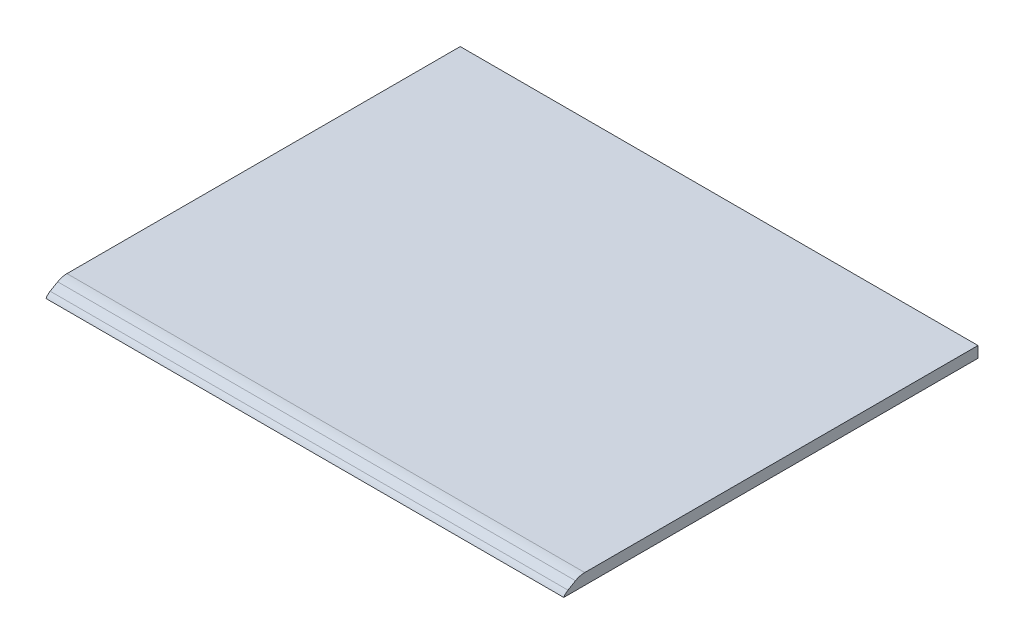
ISO-10303-21;
HEADER;
FILE_DESCRIPTION(('STEP AP214'),'2;1');
FILE_NAME('part.step','',(''),(''),'','','');
FILE_SCHEMA(('AUTOMOTIVE_DESIGN { 1 0 10303 214 1 1 1 1 }'));
ENDSEC;
DATA;
#1=APPLICATION_CONTEXT('core data for automotive mechanical design processes');
#2=APPLICATION_PROTOCOL_DEFINITION('international standard','automotive_design',2000,#1);
#3=PRODUCT_CONTEXT('',#1,'mechanical');
#4=PRODUCT('Part','Part','',(#3));
#5=PRODUCT_RELATED_PRODUCT_CATEGORY('part','',(#4));
#6=PRODUCT_DEFINITION_FORMATION('','',#4);
#7=PRODUCT_DEFINITION_CONTEXT('part definition',#1,'design');
#8=PRODUCT_DEFINITION('design','',#6,#7);
#9=PRODUCT_DEFINITION_SHAPE('','',#8);
#10=(LENGTH_UNIT() NAMED_UNIT(*) SI_UNIT(.MILLI.,.METRE.));
#11=(NAMED_UNIT(*) PLANE_ANGLE_UNIT() SI_UNIT($,.RADIAN.));
#12=(NAMED_UNIT(*) SI_UNIT($,.STERADIAN.) SOLID_ANGLE_UNIT());
#13=UNCERTAINTY_MEASURE_WITH_UNIT(LENGTH_MEASURE(1.E-05),#10,'distance_accuracy_value','');
#14=(GEOMETRIC_REPRESENTATION_CONTEXT(3) GLOBAL_UNCERTAINTY_ASSIGNED_CONTEXT((#13)) GLOBAL_UNIT_ASSIGNED_CONTEXT((#10,
#11,#12)) REPRESENTATION_CONTEXT('',''));
#15=CARTESIAN_POINT('',(0.,0.,0.));
#16=DIRECTION('',(0.,0.,1.));
#17=DIRECTION('',(1.,0.,0.));
#18=AXIS2_PLACEMENT_3D('',#15,#16,#17);
#19=CARTESIAN_POINT('',(70.,3.,-56.));
#20=DIRECTION('',(-1.,0.,0.));
#21=DIRECTION('',(0.,0.,1.));
#22=AXIS2_PLACEMENT_3D('',#19,#20,#21);
#23=PLANE('',#22);
#24=DIRECTION('',(0.,-0.500000000000001,0.866025403784438));
#25=VECTOR('',#24,1.);
#26=CARTESIAN_POINT('',(70.,3.,51.6698729810778));
#27=LINE('',#26,#25);
#28=CARTESIAN_POINT('',(70.,2.33012701892219,52.8301270189222));
#29=VERTEX_POINT('',#28);
#30=CARTESIAN_POINT('',(70.,1.15130152185752,54.8719126730958));
#31=VERTEX_POINT('',#30);
#32=EDGE_CURVE('E120',#29,#31,#27,.T.);
#33=ORIENTED_EDGE('',*,*,#32,.T.);
#34=CARTESIAN_POINT('',(70.,-1.4467746894958,53.3719126730958));
#35=DIRECTION('',(-1.,0.,0.));
#36=DIRECTION('',(0.,0.,1.));
#37=AXIS2_PLACEMENT_3D('',#34,#35,#36);
#38=CIRCLE('',#37,3.);
#39=CARTESIAN_POINT('',(70.,0.,56.));
#40=VERTEX_POINT('',#39);
#41=EDGE_CURVE('E11',#31,#40,#38,.F.);
#42=ORIENTED_EDGE('',*,*,#41,.T.);
#43=DIRECTION('',(0.,0.,-1.));
#44=VECTOR('',#43,1.);
#45=CARTESIAN_POINT('',(70.,0.,-56.));
#46=LINE('',#45,#44);
#47=CARTESIAN_POINT('',(70.,0.,-56.));
#48=VERTEX_POINT('',#47);
#49=EDGE_CURVE('E118',#40,#48,#46,.T.);
#50=ORIENTED_EDGE('',*,*,#49,.T.);
#51=DIRECTION('',(0.,-1.,0.));
#52=VECTOR('',#51,1.);
#53=CARTESIAN_POINT('',(70.,3.,-56.));
#54=LINE('',#53,#52);
#55=CARTESIAN_POINT('',(70.,3.,-56.));
#56=VERTEX_POINT('',#55);
#57=EDGE_CURVE('E109',#56,#48,#54,.T.);
#58=ORIENTED_EDGE('',*,*,#57,.F.);
#59=DIRECTION('',(0.,0.,-1.));
#60=VECTOR('',#59,1.);
#61=CARTESIAN_POINT('',(70.,3.,-56.));
#62=LINE('',#61,#60);
#63=CARTESIAN_POINT('',(70.,3.,50.3301270189222));
#64=VERTEX_POINT('',#63);
#65=EDGE_CURVE('E93',#64,#56,#62,.T.);
#66=ORIENTED_EDGE('',*,*,#65,.F.);
#67=CARTESIAN_POINT('',(70.,-2.,50.3301270189222));
#68=DIRECTION('',(-1.,0.,0.));
#69=DIRECTION('',(0.,0.,1.));
#70=AXIS2_PLACEMENT_3D('',#67,#68,#69);
#71=CIRCLE('',#70,5.);
#72=EDGE_CURVE('E133',#64,#29,#71,.F.);
#73=ORIENTED_EDGE('',*,*,#72,.T.);
#74=EDGE_LOOP('',(#33,#42,#50,#58,#66,#73));
#75=FACE_BOUND('',#74,.T.);
#76=ADVANCED_FACE('F40',(#75),#23,.F.);
#77=CARTESIAN_POINT('',(-70.,3.,-56.));
#78=DIRECTION('',(0.,0.,1.));
#79=DIRECTION('',(1.,0.,0.));
#80=AXIS2_PLACEMENT_3D('',#77,#78,#79);
#81=PLANE('',#80);
#82=DIRECTION('',(-1.,0.,0.));
#83=VECTOR('',#82,1.);
#84=CARTESIAN_POINT('',(-70.,0.,-56.));
#85=LINE('',#84,#83);
#86=CARTESIAN_POINT('',(-70.,0.,-56.));
#87=VERTEX_POINT('',#86);
#88=EDGE_CURVE('E160',#48,#87,#85,.T.);
#89=ORIENTED_EDGE('',*,*,#88,.T.);
#90=DIRECTION('',(0.,-1.,0.));
#91=VECTOR('',#90,1.);
#92=CARTESIAN_POINT('',(-70.,3.,-56.));
#93=LINE('',#92,#91);
#94=CARTESIAN_POINT('',(-70.,3.,-56.));
#95=VERTEX_POINT('',#94);
#96=EDGE_CURVE('E112',#95,#87,#93,.T.);
#97=ORIENTED_EDGE('',*,*,#96,.F.);
#98=DIRECTION('',(-1.,0.,0.));
#99=VECTOR('',#98,1.);
#100=CARTESIAN_POINT('',(-70.,3.,-56.));
#101=LINE('',#100,#99);
#102=EDGE_CURVE('E97',#56,#95,#101,.T.);
#103=ORIENTED_EDGE('',*,*,#102,.F.);
#104=ORIENTED_EDGE('',*,*,#57,.T.);
#105=EDGE_LOOP('',(#89,#97,#103,#104));
#106=FACE_BOUND('',#105,.T.);
#107=ADVANCED_FACE('F108',(#106),#81,.F.);
#108=CARTESIAN_POINT('',(-70.,3.,-56.));
#109=DIRECTION('',(1.,0.,0.));
#110=DIRECTION('',(0.,0.,-1.));
#111=AXIS2_PLACEMENT_3D('',#108,#109,#110);
#112=PLANE('',#111);
#113=DIRECTION('',(0.,0.,1.));
#114=VECTOR('',#113,1.);
#115=CARTESIAN_POINT('',(-70.,0.,-56.));
#116=LINE('',#115,#114);
#117=CARTESIAN_POINT('',(-70.,0.,56.));
#118=VERTEX_POINT('',#117);
#119=EDGE_CURVE('E164',#87,#118,#116,.T.);
#120=ORIENTED_EDGE('',*,*,#119,.T.);
#121=CARTESIAN_POINT('',(-70.,-1.4467746894958,53.3719126730958));
#122=DIRECTION('',(1.,0.,0.));
#123=DIRECTION('',(0.,0.,-1.));
#124=AXIS2_PLACEMENT_3D('',#121,#122,#123);
#125=CIRCLE('',#124,3.);
#126=CARTESIAN_POINT('',(-70.,1.15130152185751,54.8719126730958));
#127=VERTEX_POINT('',#126);
#128=EDGE_CURVE('E63',#118,#127,#125,.F.);
#129=ORIENTED_EDGE('',*,*,#128,.T.);
#130=DIRECTION('',(0.,0.500000000000001,-0.866025403784438));
#131=VECTOR('',#130,1.);
#132=CARTESIAN_POINT('',(-70.,3.,51.6698729810778));
#133=LINE('',#132,#131);
#134=CARTESIAN_POINT('',(-70.,2.33012701892219,52.8301270189222));
#135=VERTEX_POINT('',#134);
#136=EDGE_CURVE('E124',#127,#135,#133,.T.);
#137=ORIENTED_EDGE('',*,*,#136,.T.);
#138=CARTESIAN_POINT('',(-70.,-2.,50.3301270189222));
#139=DIRECTION('',(1.,0.,0.));
#140=DIRECTION('',(0.,0.,-1.));
#141=AXIS2_PLACEMENT_3D('',#138,#139,#140);
#142=CIRCLE('',#141,5.);
#143=CARTESIAN_POINT('',(-70.,3.,50.3301270189222));
#144=VERTEX_POINT('',#143);
#145=EDGE_CURVE('E140',#135,#144,#142,.F.);
#146=ORIENTED_EDGE('',*,*,#145,.T.);
#147=DIRECTION('',(0.,0.,1.));
#148=VECTOR('',#147,1.);
#149=CARTESIAN_POINT('',(-70.,3.,-56.));
#150=LINE('',#149,#148);
#151=EDGE_CURVE('E115',#95,#144,#150,.T.);
#152=ORIENTED_EDGE('',*,*,#151,.F.);
#153=ORIENTED_EDGE('',*,*,#96,.T.);
#154=EDGE_LOOP('',(#120,#129,#137,#146,#152,#153));
#155=FACE_BOUND('',#154,.T.);
#156=ADVANCED_FACE('F146',(#155),#112,.F.);
#157=CARTESIAN_POINT('',(0.,3.,0.));
#158=DIRECTION('',(0.,1.,0.));
#159=DIRECTION('',(0.,0.,1.));
#160=AXIS2_PLACEMENT_3D('',#157,#158,#159);
#161=PLANE('',#160);
#162=ORIENTED_EDGE('',*,*,#151,.T.);
#163=DIRECTION('',(1.,0.,0.));
#164=VECTOR('',#163,1.);
#165=CARTESIAN_POINT('',(0.,3.,50.3301270189222));
#166=LINE('',#165,#164);
#167=EDGE_CURVE('E100',#144,#64,#166,.T.);
#168=ORIENTED_EDGE('',*,*,#167,.T.);
#169=ORIENTED_EDGE('',*,*,#65,.T.);
#170=ORIENTED_EDGE('',*,*,#102,.T.);
#171=EDGE_LOOP('',(#162,#168,#169,#170));
#172=FACE_BOUND('',#171,.T.);
#173=ADVANCED_FACE('F96',(#172),#161,.T.);
#174=CARTESIAN_POINT('',(0.,0.,0.));
#175=DIRECTION('',(0.,1.,0.));
#176=DIRECTION('',(0.,0.,1.));
#177=AXIS2_PLACEMENT_3D('',#174,#175,#176);
#178=PLANE('',#177);
#179=ORIENTED_EDGE('',*,*,#49,.F.);
#180=DIRECTION('',(1.,0.,0.));
#181=VECTOR('',#180,1.);
#182=CARTESIAN_POINT('',(-70.,0.,56.));
#183=LINE('',#182,#181);
#184=EDGE_CURVE('E104',#118,#40,#183,.T.);
#185=ORIENTED_EDGE('',*,*,#184,.F.);
#186=ORIENTED_EDGE('',*,*,#119,.F.);
#187=ORIENTED_EDGE('',*,*,#88,.F.);
#188=EDGE_LOOP('',(#179,#185,#186,#187));
#189=FACE_BOUND('',#188,.T.);
#190=ADVANCED_FACE('F158',(#189),#178,.F.);
#191=CARTESIAN_POINT('',(0.,3.,51.6698729810778));
#192=DIRECTION('',(0.,0.866025403784438,0.500000000000001));
#193=DIRECTION('',(-1.,0.,0.));
#194=AXIS2_PLACEMENT_3D('',#191,#192,#193);
#195=PLANE('',#194);
#196=ORIENTED_EDGE('',*,*,#136,.F.);
#197=DIRECTION('',(-1.,0.,0.));
#198=VECTOR('',#197,1.);
#199=CARTESIAN_POINT('',(70.,1.15130152185751,54.8719126730958));
#200=LINE('',#199,#198);
#201=EDGE_CURVE('E49',#127,#31,#200,.F.);
#202=ORIENTED_EDGE('',*,*,#201,.T.);
#203=ORIENTED_EDGE('',*,*,#32,.F.);
#204=DIRECTION('',(1.,0.,0.));
#205=VECTOR('',#204,1.);
#206=CARTESIAN_POINT('',(0.,2.33012701892219,52.8301270189222));
#207=LINE('',#206,#205);
#208=EDGE_CURVE('E136',#29,#135,#207,.F.);
#209=ORIENTED_EDGE('',*,*,#208,.T.);
#210=EDGE_LOOP('',(#196,#202,#203,#209));
#211=FACE_BOUND('',#210,.T.);
#212=ADVANCED_FACE('F153',(#211),#195,.T.);
#213=CARTESIAN_POINT('',(0.,-2.,50.3301270189222));
#214=DIRECTION('',(1.,0.,0.));
#215=DIRECTION('',(0.,0.,-1.));
#216=AXIS2_PLACEMENT_3D('',#213,#214,#215);
#217=CYLINDRICAL_SURFACE('',#216,5.);
#218=ORIENTED_EDGE('',*,*,#145,.F.);
#219=ORIENTED_EDGE('',*,*,#208,.F.);
#220=ORIENTED_EDGE('',*,*,#72,.F.);
#221=ORIENTED_EDGE('',*,*,#167,.F.);
#222=EDGE_LOOP('',(#218,#219,#220,#221));
#223=FACE_BOUND('',#222,.T.);
#224=ADVANCED_FACE('F151',(#223),#217,.T.);
#225=CARTESIAN_POINT('',(-70.,-1.4467746894958,53.3719126730958));
#226=DIRECTION('',(1.,0.,0.));
#227=DIRECTION('',(0.,0.,-1.));
#228=AXIS2_PLACEMENT_3D('',#225,#226,#227);
#229=CYLINDRICAL_SURFACE('',#228,3.);
#230=ORIENTED_EDGE('',*,*,#41,.F.);
#231=ORIENTED_EDGE('',*,*,#201,.F.);
#232=ORIENTED_EDGE('',*,*,#128,.F.);
#233=ORIENTED_EDGE('',*,*,#184,.T.);
#234=EDGE_LOOP('',(#230,#231,#232,#233));
#235=FACE_BOUND('',#234,.T.);
#236=ADVANCED_FACE('F42',(#235),#229,.T.);
#237=CLOSED_SHELL('',(#76,#107,#156,#173,#190,#212,#224,#236));
#238=MANIFOLD_SOLID_BREP('B2',#237);
#239=ADVANCED_BREP_SHAPE_REPRESENTATION('',(#18,#238),#14);
#240=SHAPE_DEFINITION_REPRESENTATION(#9,#239);
ENDSEC;
END-ISO-10303-21;
